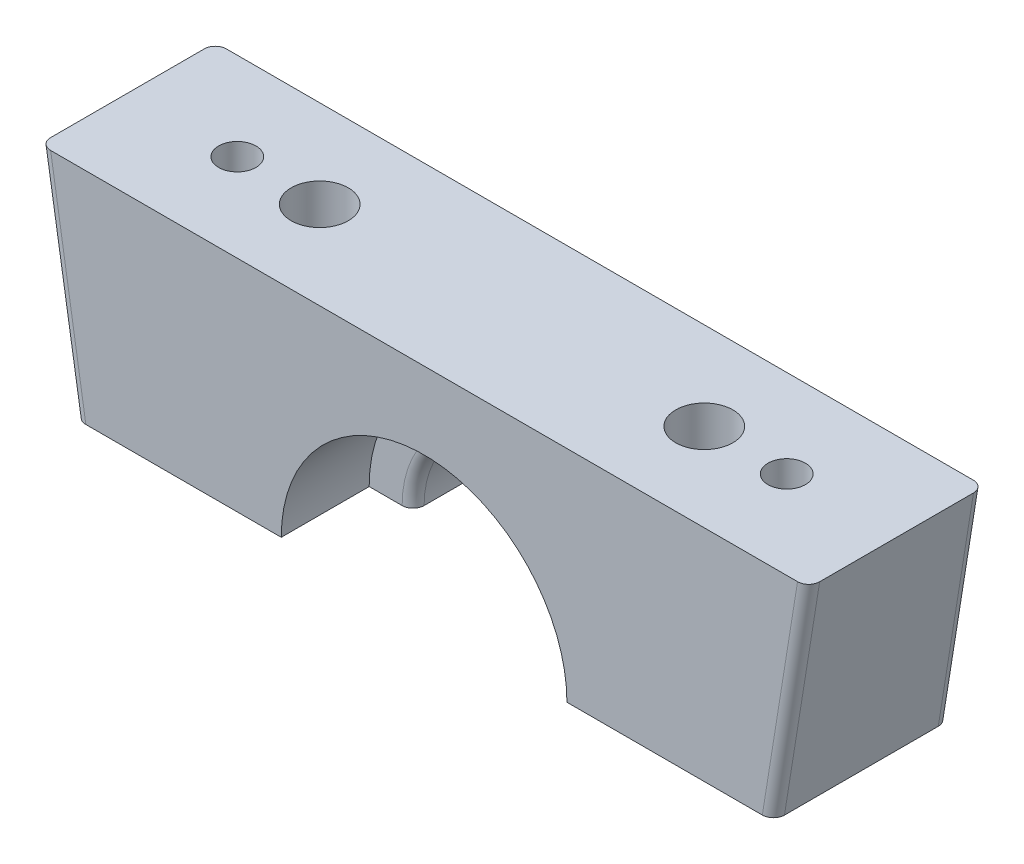
ISO-10303-21;
HEADER;
FILE_DESCRIPTION(('STEP AP214'),'2;1');
FILE_NAME('part.step','',(''),(''),'','','');
FILE_SCHEMA(('AUTOMOTIVE_DESIGN { 1 0 10303 214 1 1 1 1 }'));
ENDSEC;
DATA;
#1=APPLICATION_CONTEXT('core data for automotive mechanical design processes');
#2=APPLICATION_PROTOCOL_DEFINITION('international standard','automotive_design',2000,#1);
#3=PRODUCT_CONTEXT('',#1,'mechanical');
#4=PRODUCT('Part','Part','',(#3));
#5=PRODUCT_RELATED_PRODUCT_CATEGORY('part','',(#4));
#6=PRODUCT_DEFINITION_FORMATION('','',#4);
#7=PRODUCT_DEFINITION_CONTEXT('part definition',#1,'design');
#8=PRODUCT_DEFINITION('design','',#6,#7);
#9=PRODUCT_DEFINITION_SHAPE('','',#8);
#10=(LENGTH_UNIT() NAMED_UNIT(*) SI_UNIT(.MILLI.,.METRE.));
#11=(NAMED_UNIT(*) PLANE_ANGLE_UNIT() SI_UNIT($,.RADIAN.));
#12=(NAMED_UNIT(*) SI_UNIT($,.STERADIAN.) SOLID_ANGLE_UNIT());
#13=UNCERTAINTY_MEASURE_WITH_UNIT(LENGTH_MEASURE(1.E-05),#10,'distance_accuracy_value','');
#14=(GEOMETRIC_REPRESENTATION_CONTEXT(3) GLOBAL_UNCERTAINTY_ASSIGNED_CONTEXT((#13)) GLOBAL_UNIT_ASSIGNED_CONTEXT((#10,
#11,#12)) REPRESENTATION_CONTEXT('',''));
#15=CARTESIAN_POINT('',(0.,0.,0.));
#16=DIRECTION('',(0.,0.,1.));
#17=DIRECTION('',(1.,0.,0.));
#18=AXIS2_PLACEMENT_3D('',#15,#16,#17);
#19=CARTESIAN_POINT('',(-17.5,-20.,0.));
#20=DIRECTION('',(0.,-1.,0.));
#21=DIRECTION('',(0.,0.,-1.));
#22=AXIS2_PLACEMENT_3D('',#19,#20,#21);
#23=CYLINDRICAL_SURFACE('',#22,2.6);
#24=CARTESIAN_POINT('',(-17.5,0.,0.));
#25=DIRECTION('',(0.,-1.,0.));
#26=DIRECTION('',(0.,0.,-1.));
#27=AXIS2_PLACEMENT_3D('',#24,#25,#26);
#28=CIRCLE('',#27,2.6);
#29=CARTESIAN_POINT('',(-17.5,0.,-2.6));
#30=VERTEX_POINT('',#29);
#31=EDGE_CURVE('E366',#30,#30,#28,.T.);
#32=ORIENTED_EDGE('',*,*,#31,.F.);
#33=EDGE_LOOP('',(#32));
#34=FACE_BOUND('',#33,.T.);
#35=CARTESIAN_POINT('',(-17.5,-10.,0.));
#36=DIRECTION('',(0.,-1.,0.));
#37=DIRECTION('',(1.,0.,0.));
#38=AXIS2_PLACEMENT_3D('',#35,#36,#37);
#39=CIRCLE('',#38,2.6);
#40=CARTESIAN_POINT('',(-14.9,-10.,0.));
#41=VERTEX_POINT('',#40);
#42=EDGE_CURVE('E248',#41,#41,#39,.F.);
#43=ORIENTED_EDGE('',*,*,#42,.F.);
#44=EDGE_LOOP('',(#43));
#45=FACE_BOUND('',#44,.T.);
#46=ADVANCED_FACE('F39',(#34,#45),#23,.F.);
#47=CARTESIAN_POINT('',(17.5,-20.,0.));
#48=DIRECTION('',(0.,-1.,0.));
#49=DIRECTION('',(0.,0.,-1.));
#50=AXIS2_PLACEMENT_3D('',#47,#48,#49);
#51=CYLINDRICAL_SURFACE('',#50,2.6);
#52=CARTESIAN_POINT('',(17.5,0.,0.));
#53=DIRECTION('',(0.,-1.,0.));
#54=DIRECTION('',(0.,0.,-1.));
#55=AXIS2_PLACEMENT_3D('',#52,#53,#54);
#56=CIRCLE('',#55,2.6);
#57=CARTESIAN_POINT('',(17.5,0.,-2.6));
#58=VERTEX_POINT('',#57);
#59=EDGE_CURVE('E253',#58,#58,#56,.T.);
#60=ORIENTED_EDGE('',*,*,#59,.F.);
#61=EDGE_LOOP('',(#60));
#62=FACE_BOUND('',#61,.T.);
#63=CARTESIAN_POINT('',(17.5,-10.,0.));
#64=DIRECTION('',(0.,-1.,0.));
#65=DIRECTION('',(1.,0.,0.));
#66=AXIS2_PLACEMENT_3D('',#63,#64,#65);
#67=CIRCLE('',#66,2.6);
#68=CARTESIAN_POINT('',(20.1,-10.,0.));
#69=VERTEX_POINT('',#68);
#70=EDGE_CURVE('E244',#69,#69,#67,.F.);
#71=ORIENTED_EDGE('',*,*,#70,.F.);
#72=EDGE_LOOP('',(#71));
#73=FACE_BOUND('',#72,.T.);
#74=ADVANCED_FACE('F383',(#62,#73),#51,.F.);
#75=CARTESIAN_POINT('',(31.7948717948718,-20.,8.));
#76=DIRECTION('',(0.,1.,0.));
#77=DIRECTION('',(-1.,0.,0.));
#78=AXIS2_PLACEMENT_3D('',#75,#76,#77);
#79=PLANE('',#78);
#80=CARTESIAN_POINT('',(-17.5,-20.,0.));
#81=DIRECTION('',(0.,-1.,0.));
#82=DIRECTION('',(1.,0.,0.));
#83=AXIS2_PLACEMENT_3D('',#80,#81,#82);
#84=CIRCLE('',#83,3.25);
#85=CARTESIAN_POINT('',(-14.25,-20.,0.));
#86=VERTEX_POINT('',#85);
#87=EDGE_CURVE('E355',#86,#86,#84,.T.);
#88=ORIENTED_EDGE('',*,*,#87,.F.);
#89=EDGE_LOOP('',(#88));
#90=FACE_BOUND('',#89,.T.);
#91=DIRECTION('',(0.,0.,-1.));
#92=VECTOR('',#91,1.);
#93=CARTESIAN_POINT('',(-9.,-20.,93.1732257679211));
#94=LINE('',#93,#92);
#95=CARTESIAN_POINT('',(-9.,-20.,-1.));
#96=VERTEX_POINT('',#95);
#97=CARTESIAN_POINT('',(-9.,-20.,-7.00000000000001));
#98=VERTEX_POINT('',#97);
#99=EDGE_CURVE('E209',#96,#98,#94,.T.);
#100=ORIENTED_EDGE('',*,*,#99,.F.);
#101=CARTESIAN_POINT('',(-10.,-20.,-1.));
#102=DIRECTION('',(0.,1.,0.));
#103=DIRECTION('',(-1.,0.,0.));
#104=AXIS2_PLACEMENT_3D('',#101,#102,#103);
#105=CIRCLE('',#104,1.);
#106=CARTESIAN_POINT('',(-10.,-20.,0.));
#107=VERTEX_POINT('',#106);
#108=EDGE_CURVE('E199',#96,#107,#105,.F.);
#109=ORIENTED_EDGE('',*,*,#108,.T.);
#110=DIRECTION('',(1.,0.,0.));
#111=VECTOR('',#110,1.);
#112=CARTESIAN_POINT('',(-13.,-20.,0.));
#113=LINE('',#112,#111);
#114=CARTESIAN_POINT('',(-13.,-20.,0.));
#115=VERTEX_POINT('',#114);
#116=EDGE_CURVE('E184',#115,#107,#113,.T.);
#117=ORIENTED_EDGE('',*,*,#116,.F.);
#118=DIRECTION('',(0.,0.,1.));
#119=VECTOR('',#118,1.);
#120=CARTESIAN_POINT('',(-13.,-20.,0.));
#121=LINE('',#120,#119);
#122=CARTESIAN_POINT('',(-13.,-20.,8.));
#123=VERTEX_POINT('',#122);
#124=EDGE_CURVE('E172',#115,#123,#121,.T.);
#125=ORIENTED_EDGE('',*,*,#124,.T.);
#126=DIRECTION('',(1.,0.,0.));
#127=VECTOR('',#126,1.);
#128=CARTESIAN_POINT('',(31.7948717948718,-20.,8.));
#129=LINE('',#128,#127);
#130=CARTESIAN_POINT('',(-30.7821121407444,-20.,8.));
#131=VERTEX_POINT('',#130);
#132=EDGE_CURVE('E221',#131,#123,#129,.T.);
#133=ORIENTED_EDGE('',*,*,#132,.F.);
#134=CARTESIAN_POINT('',(-30.7821121407444,-20.,7.));
#135=DIRECTION('',(0.,1.,0.));
#136=DIRECTION('',(1.,0.,0.));
#137=AXIS2_PLACEMENT_3D('',#134,#135,#136);
#138=ELLIPSE('',#137,1.01275965412741,1.);
#139=CARTESIAN_POINT('',(-31.7948717948718,-20.,7.));
#140=VERTEX_POINT('',#139);
#141=EDGE_CURVE('E277',#131,#140,#138,.F.);
#142=ORIENTED_EDGE('',*,*,#141,.T.);
#143=DIRECTION('',(0.,0.,-1.));
#144=VECTOR('',#143,1.);
#145=CARTESIAN_POINT('',(-31.7948717948718,-20.,8.));
#146=LINE('',#145,#144);
#147=CARTESIAN_POINT('',(-31.7948717948718,-20.,-7.));
#148=VERTEX_POINT('',#147);
#149=EDGE_CURVE('E211',#140,#148,#146,.T.);
#150=ORIENTED_EDGE('',*,*,#149,.T.);
#151=CARTESIAN_POINT('',(-30.7821121407444,-20.,-7.));
#152=DIRECTION('',(0.,1.,0.));
#153=DIRECTION('',(-1.,0.,0.));
#154=AXIS2_PLACEMENT_3D('',#151,#152,#153);
#155=ELLIPSE('',#154,1.01275965412741,1.);
#156=CARTESIAN_POINT('',(-30.7821121407444,-20.,-8.));
#157=VERTEX_POINT('',#156);
#158=EDGE_CURVE('E274',#148,#157,#155,.F.);
#159=ORIENTED_EDGE('',*,*,#158,.T.);
#160=DIRECTION('',(1.,0.,0.));
#161=VECTOR('',#160,1.);
#162=CARTESIAN_POINT('',(31.7948717948718,-20.,-8.));
#163=LINE('',#162,#161);
#164=CARTESIAN_POINT('',(-10.,-20.,-8.));
#165=VERTEX_POINT('',#164);
#166=EDGE_CURVE('E229',#157,#165,#163,.T.);
#167=ORIENTED_EDGE('',*,*,#166,.T.);
#168=CARTESIAN_POINT('',(-10.,-20.,-7.00000000000001));
#169=DIRECTION('',(0.,1.,0.));
#170=DIRECTION('',(-1.,0.,0.));
#171=AXIS2_PLACEMENT_3D('',#168,#169,#170);
#172=CIRCLE('',#171,1.);
#173=EDGE_CURVE('E280',#165,#98,#172,.F.);
#174=ORIENTED_EDGE('',*,*,#173,.T.);
#175=EDGE_LOOP('',(#100,#109,#117,#125,#133,#142,#150,#159,#167,#174));
#176=FACE_BOUND('',#175,.T.);
#177=CARTESIAN_POINT('',(-25.,-20.,0.));
#178=DIRECTION('',(0.,-1.,0.));
#179=DIRECTION('',(0.,0.,-1.));
#180=AXIS2_PLACEMENT_3D('',#177,#178,#179);
#181=CIRCLE('',#180,3.15);
#182=CARTESIAN_POINT('',(-25.,-20.,-3.15));
#183=VERTEX_POINT('',#182);
#184=EDGE_CURVE('E665',#183,#183,#181,.T.);
#185=ORIENTED_EDGE('',*,*,#184,.F.);
#186=EDGE_LOOP('',(#185));
#187=FACE_BOUND('',#186,.T.);
#188=ADVANCED_FACE('F196',(#90,#176,#187),#79,.F.);
#189=CARTESIAN_POINT('',(17.5,-20.,0.));
#190=DIRECTION('',(0.,-1.,0.));
#191=DIRECTION('',(1.,0.,0.));
#192=AXIS2_PLACEMENT_3D('',#189,#190,#191);
#193=CIRCLE('',#192,3.25);
#194=CARTESIAN_POINT('',(20.75,-20.,0.));
#195=VERTEX_POINT('',#194);
#196=EDGE_CURVE('E356',#195,#195,#193,.T.);
#197=ORIENTED_EDGE('',*,*,#196,.F.);
#198=EDGE_LOOP('',(#197));
#199=FACE_BOUND('',#198,.T.);
#200=CARTESIAN_POINT('',(10.,-20.,0.));
#201=VERTEX_POINT('',#200);
#202=CARTESIAN_POINT('',(13.,-20.,0.));
#203=VERTEX_POINT('',#202);
#204=EDGE_CURVE('E192',#201,#203,#113,.T.);
#205=ORIENTED_EDGE('',*,*,#204,.F.);
#206=CARTESIAN_POINT('',(10.,-20.,-1.));
#207=DIRECTION('',(0.,1.,0.));
#208=DIRECTION('',(-1.,0.,0.));
#209=AXIS2_PLACEMENT_3D('',#206,#207,#208);
#210=CIRCLE('',#209,1.);
#211=CARTESIAN_POINT('',(9.,-20.,-1.));
#212=VERTEX_POINT('',#211);
#213=EDGE_CURVE('E265',#201,#212,#210,.F.);
#214=ORIENTED_EDGE('',*,*,#213,.T.);
#215=DIRECTION('',(0.,0.,-1.));
#216=VECTOR('',#215,1.);
#217=CARTESIAN_POINT('',(9.,-20.,93.1732257679211));
#218=LINE('',#217,#216);
#219=CARTESIAN_POINT('',(9.,-20.,-7.00000000000001));
#220=VERTEX_POINT('',#219);
#221=EDGE_CURVE('E677',#212,#220,#218,.T.);
#222=ORIENTED_EDGE('',*,*,#221,.T.);
#223=CARTESIAN_POINT('',(10.,-20.,-7.00000000000001));
#224=DIRECTION('',(0.,1.,0.));
#225=DIRECTION('',(-1.,0.,0.));
#226=AXIS2_PLACEMENT_3D('',#223,#224,#225);
#227=CIRCLE('',#226,1.);
#228=CARTESIAN_POINT('',(10.,-20.,-8.));
#229=VERTEX_POINT('',#228);
#230=EDGE_CURVE('E262',#220,#229,#227,.F.);
#231=ORIENTED_EDGE('',*,*,#230,.T.);
#232=CARTESIAN_POINT('',(30.7821121407444,-20.,-8.));
#233=VERTEX_POINT('',#232);
#234=EDGE_CURVE('E220',#229,#233,#163,.T.);
#235=ORIENTED_EDGE('',*,*,#234,.T.);
#236=CARTESIAN_POINT('',(30.7821121407444,-20.,-7.));
#237=DIRECTION('',(0.,1.,0.));
#238=DIRECTION('',(-1.,0.,0.));
#239=AXIS2_PLACEMENT_3D('',#236,#237,#238);
#240=ELLIPSE('',#239,1.01275965412741,1.);
#241=CARTESIAN_POINT('',(31.7948717948718,-20.,-7.));
#242=VERTEX_POINT('',#241);
#243=EDGE_CURVE('E256',#233,#242,#240,.F.);
#244=ORIENTED_EDGE('',*,*,#243,.T.);
#245=DIRECTION('',(0.,0.,-1.));
#246=VECTOR('',#245,1.);
#247=CARTESIAN_POINT('',(31.7948717948718,-20.,8.));
#248=LINE('',#247,#246);
#249=CARTESIAN_POINT('',(31.7948717948718,-20.,7.));
#250=VERTEX_POINT('',#249);
#251=EDGE_CURVE('E239',#250,#242,#248,.T.);
#252=ORIENTED_EDGE('',*,*,#251,.F.);
#253=CARTESIAN_POINT('',(30.7821121407444,-20.,7.));
#254=DIRECTION('',(0.,1.,0.));
#255=DIRECTION('',(1.,0.,0.));
#256=AXIS2_PLACEMENT_3D('',#253,#254,#255);
#257=ELLIPSE('',#256,1.01275965412741,1.);
#258=CARTESIAN_POINT('',(30.7821121407444,-20.,8.));
#259=VERTEX_POINT('',#258);
#260=EDGE_CURVE('E259',#250,#259,#257,.F.);
#261=ORIENTED_EDGE('',*,*,#260,.T.);
#262=CARTESIAN_POINT('',(13.,-20.,8.));
#263=VERTEX_POINT('',#262);
#264=EDGE_CURVE('E224',#263,#259,#129,.T.);
#265=ORIENTED_EDGE('',*,*,#264,.F.);
#266=DIRECTION('',(0.,0.,1.));
#267=VECTOR('',#266,1.);
#268=CARTESIAN_POINT('',(13.,-20.,0.));
#269=LINE('',#268,#267);
#270=EDGE_CURVE('E183',#203,#263,#269,.T.);
#271=ORIENTED_EDGE('',*,*,#270,.F.);
#272=EDGE_LOOP('',(#205,#214,#222,#231,#235,#244,#252,#261,#265,#271));
#273=FACE_BOUND('',#272,.T.);
#274=CARTESIAN_POINT('',(25.,-20.,0.));
#275=DIRECTION('',(0.,-1.,0.));
#276=DIRECTION('',(0.,0.,-1.));
#277=AXIS2_PLACEMENT_3D('',#274,#275,#276);
#278=CIRCLE('',#277,3.15);
#279=CARTESIAN_POINT('',(25.,-20.,-3.15));
#280=VERTEX_POINT('',#279);
#281=EDGE_CURVE('E362',#280,#280,#278,.T.);
#282=ORIENTED_EDGE('',*,*,#281,.F.);
#283=EDGE_LOOP('',(#282));
#284=FACE_BOUND('',#283,.T.);
#285=ADVANCED_FACE('F346',(#199,#273,#284),#79,.F.);
#286=CARTESIAN_POINT('',(35.,0.,8.));
#287=DIRECTION('',(-0.987401103435145,0.158237356319735,0.));
#288=DIRECTION('',(-0.158237356319735,-0.987401103435145,0.));
#289=AXIS2_PLACEMENT_3D('',#286,#287,#288);
#290=PLANE('',#289);
#291=DIRECTION('',(0.,0.,-1.));
#292=VECTOR('',#291,1.);
#293=CARTESIAN_POINT('',(35.,0.,8.));
#294=LINE('',#293,#292);
#295=CARTESIAN_POINT('',(35.,0.,7.));
#296=VERTEX_POINT('',#295);
#297=CARTESIAN_POINT('',(35.,0.,-7.));
#298=VERTEX_POINT('',#297);
#299=EDGE_CURVE('E228',#296,#298,#294,.T.);
#300=ORIENTED_EDGE('',*,*,#299,.F.);
#301=DIRECTION('',(0.158237356319735,0.987401103435145,0.));
#302=VECTOR('',#301,1.);
#303=CARTESIAN_POINT('',(35.,0.,7.));
#304=LINE('',#303,#302);
#305=EDGE_CURVE('E315',#296,#250,#304,.F.);
#306=ORIENTED_EDGE('',*,*,#305,.T.);
#307=ORIENTED_EDGE('',*,*,#251,.T.);
#308=DIRECTION('',(0.158237356319735,0.987401103435145,0.));
#309=VECTOR('',#308,1.);
#310=CARTESIAN_POINT('',(35.,0.,-7.));
#311=LINE('',#310,#309);
#312=EDGE_CURVE('E312',#242,#298,#311,.T.);
#313=ORIENTED_EDGE('',*,*,#312,.T.);
#314=EDGE_LOOP('',(#300,#306,#307,#313));
#315=FACE_BOUND('',#314,.T.);
#316=ADVANCED_FACE('F337',(#315),#290,.F.);
#317=CARTESIAN_POINT('',(0.,0.,8.));
#318=DIRECTION('',(0.,-1.,0.));
#319=DIRECTION('',(0.,0.,-1.));
#320=AXIS2_PLACEMENT_3D('',#317,#318,#319);
#321=PLANE('',#320);
#322=ORIENTED_EDGE('',*,*,#59,.T.);
#323=EDGE_LOOP('',(#322));
#324=FACE_BOUND('',#323,.T.);
#325=ORIENTED_EDGE('',*,*,#31,.T.);
#326=EDGE_LOOP('',(#325));
#327=FACE_BOUND('',#326,.T.);
#328=CARTESIAN_POINT('',(25.,0.,0.));
#329=DIRECTION('',(0.,-1.,0.));
#330=DIRECTION('',(0.,0.,-1.));
#331=AXIS2_PLACEMENT_3D('',#328,#329,#330);
#332=CIRCLE('',#331,1.7);
#333=CARTESIAN_POINT('',(25.,0.,-1.7));
#334=VERTEX_POINT('',#333);
#335=EDGE_CURVE('E369',#334,#334,#332,.T.);
#336=ORIENTED_EDGE('',*,*,#335,.T.);
#337=EDGE_LOOP('',(#336));
#338=FACE_BOUND('',#337,.T.);
#339=CARTESIAN_POINT('',(-25.,0.,0.));
#340=DIRECTION('',(0.,-1.,0.));
#341=DIRECTION('',(0.,0.,-1.));
#342=AXIS2_PLACEMENT_3D('',#339,#340,#341);
#343=CIRCLE('',#342,1.7);
#344=CARTESIAN_POINT('',(-25.,0.,-1.7));
#345=VERTEX_POINT('',#344);
#346=EDGE_CURVE('E673',#345,#345,#343,.T.);
#347=ORIENTED_EDGE('',*,*,#346,.T.);
#348=EDGE_LOOP('',(#347));
#349=FACE_BOUND('',#348,.T.);
#350=DIRECTION('',(-1.,0.,0.));
#351=VECTOR('',#350,1.);
#352=CARTESIAN_POINT('',(0.,0.,8.));
#353=LINE('',#352,#351);
#354=CARTESIAN_POINT('',(33.9872403458726,0.,8.));
#355=VERTEX_POINT('',#354);
#356=CARTESIAN_POINT('',(-33.9872403458726,0.,8.));
#357=VERTEX_POINT('',#356);
#358=EDGE_CURVE('E223',#355,#357,#353,.T.);
#359=ORIENTED_EDGE('',*,*,#358,.F.);
#360=CARTESIAN_POINT('',(33.9872403458726,0.,7.));
#361=DIRECTION('',(0.,-1.,0.));
#362=DIRECTION('',(1.,0.,0.));
#363=AXIS2_PLACEMENT_3D('',#360,#361,#362);
#364=ELLIPSE('',#363,1.01275965412741,1.);
#365=EDGE_CURVE('E68',#355,#296,#364,.F.);
#366=ORIENTED_EDGE('',*,*,#365,.T.);
#367=ORIENTED_EDGE('',*,*,#299,.T.);
#368=CARTESIAN_POINT('',(33.9872403458726,0.,-7.));
#369=DIRECTION('',(0.,-1.,0.));
#370=DIRECTION('',(-1.,0.,0.));
#371=AXIS2_PLACEMENT_3D('',#368,#369,#370);
#372=ELLIPSE('',#371,1.01275965412741,1.);
#373=CARTESIAN_POINT('',(33.9872403458726,0.,-8.));
#374=VERTEX_POINT('',#373);
#375=EDGE_CURVE('E58',#298,#374,#372,.F.);
#376=ORIENTED_EDGE('',*,*,#375,.T.);
#377=DIRECTION('',(-1.,0.,0.));
#378=VECTOR('',#377,1.);
#379=CARTESIAN_POINT('',(0.,0.,-8.));
#380=LINE('',#379,#378);
#381=CARTESIAN_POINT('',(-33.9872403458726,0.,-8.));
#382=VERTEX_POINT('',#381);
#383=EDGE_CURVE('E233',#374,#382,#380,.T.);
#384=ORIENTED_EDGE('',*,*,#383,.T.);
#385=CARTESIAN_POINT('',(-33.9872403458726,0.,-7.));
#386=DIRECTION('',(0.,-1.,0.));
#387=DIRECTION('',(-1.,0.,0.));
#388=AXIS2_PLACEMENT_3D('',#385,#386,#387);
#389=ELLIPSE('',#388,1.01275965412741,1.);
#390=CARTESIAN_POINT('',(-35.,0.,-7.));
#391=VERTEX_POINT('',#390);
#392=EDGE_CURVE('E304',#382,#391,#389,.F.);
#393=ORIENTED_EDGE('',*,*,#392,.T.);
#394=DIRECTION('',(0.,0.,-1.));
#395=VECTOR('',#394,1.);
#396=CARTESIAN_POINT('',(-35.,0.,8.));
#397=LINE('',#396,#395);
#398=CARTESIAN_POINT('',(-35.,0.,7.));
#399=VERTEX_POINT('',#398);
#400=EDGE_CURVE('E216',#399,#391,#397,.T.);
#401=ORIENTED_EDGE('',*,*,#400,.F.);
#402=CARTESIAN_POINT('',(-33.9872403458726,0.,7.));
#403=DIRECTION('',(0.,-1.,0.));
#404=DIRECTION('',(1.,0.,0.));
#405=AXIS2_PLACEMENT_3D('',#402,#403,#404);
#406=ELLIPSE('',#405,1.01275965412741,1.);
#407=EDGE_CURVE('E307',#399,#357,#406,.F.);
#408=ORIENTED_EDGE('',*,*,#407,.T.);
#409=EDGE_LOOP('',(#359,#366,#367,#376,#384,#393,#401,#408));
#410=FACE_BOUND('',#409,.T.);
#411=ADVANCED_FACE('F334',(#324,#327,#338,#349,#410),#321,.F.);
#412=CARTESIAN_POINT('',(0.,0.,8.));
#413=DIRECTION('',(0.,0.,-1.));
#414=DIRECTION('',(-1.,0.,0.));
#415=AXIS2_PLACEMENT_3D('',#412,#413,#414);
#416=PLANE('',#415);
#417=ORIENTED_EDGE('',*,*,#264,.T.);
#418=DIRECTION('',(0.158237356319735,0.987401103435145,0.));
#419=VECTOR('',#418,1.);
#420=CARTESIAN_POINT('',(33.1362317638378,-5.31029355189708,8.));
#421=LINE('',#420,#419);
#422=EDGE_CURVE('E298',#259,#355,#421,.T.);
#423=ORIENTED_EDGE('',*,*,#422,.T.);
#424=ORIENTED_EDGE('',*,*,#358,.T.);
#425=DIRECTION('',(-0.158237356319735,0.987401103435145,0.));
#426=VECTOR('',#425,1.);
#427=CARTESIAN_POINT('',(-30.8074706914367,-19.8417626436803,8.));
#428=LINE('',#427,#426);
#429=EDGE_CURVE('E295',#357,#131,#428,.F.);
#430=ORIENTED_EDGE('',*,*,#429,.T.);
#431=ORIENTED_EDGE('',*,*,#132,.T.);
#432=CARTESIAN_POINT('',(0.,-20.,8.));
#433=DIRECTION('',(0.,0.,1.));
#434=DIRECTION('',(1.,0.,0.));
#435=AXIS2_PLACEMENT_3D('',#432,#433,#434);
#436=CIRCLE('',#435,13.);
#437=EDGE_CURVE('E178',#263,#123,#436,.T.);
#438=ORIENTED_EDGE('',*,*,#437,.F.);
#439=EDGE_LOOP('',(#417,#423,#424,#430,#431,#438));
#440=FACE_BOUND('',#439,.T.);
#441=ADVANCED_FACE('F349',(#440),#416,.F.);
#442=CARTESIAN_POINT('',(0.,0.,-8.));
#443=DIRECTION('',(0.,0.,-1.));
#444=DIRECTION('',(-1.,0.,0.));
#445=AXIS2_PLACEMENT_3D('',#442,#443,#444);
#446=PLANE('',#445);
#447=ORIENTED_EDGE('',*,*,#234,.F.);
#448=CARTESIAN_POINT('',(0.,-20.,-8.));
#449=DIRECTION('',(0.,0.,-1.));
#450=DIRECTION('',(-1.,0.,0.));
#451=AXIS2_PLACEMENT_3D('',#448,#449,#450);
#452=CIRCLE('',#451,10.);
#453=EDGE_CURVE('E291',#229,#165,#452,.F.);
#454=ORIENTED_EDGE('',*,*,#453,.T.);
#455=ORIENTED_EDGE('',*,*,#166,.F.);
#456=DIRECTION('',(-0.158237356319735,0.987401103435145,0.));
#457=VECTOR('',#456,1.);
#458=CARTESIAN_POINT('',(-33.1362317638378,-5.31029355189708,-8.));
#459=LINE('',#458,#457);
#460=EDGE_CURVE('E287',#157,#382,#459,.T.);
#461=ORIENTED_EDGE('',*,*,#460,.T.);
#462=ORIENTED_EDGE('',*,*,#383,.F.);
#463=DIRECTION('',(0.158237356319735,0.987401103435145,0.));
#464=VECTOR('',#463,1.);
#465=CARTESIAN_POINT('',(30.8074706914367,-19.8417626436803,-8.));
#466=LINE('',#465,#464);
#467=EDGE_CURVE('E284',#374,#233,#466,.F.);
#468=ORIENTED_EDGE('',*,*,#467,.T.);
#469=EDGE_LOOP('',(#447,#454,#455,#461,#462,#468));
#470=FACE_BOUND('',#469,.T.);
#471=ADVANCED_FACE('F333',(#470),#446,.T.);
#472=CARTESIAN_POINT('',(-35.,0.,8.));
#473=DIRECTION('',(-0.987401103435145,-0.158237356319735,0.));
#474=DIRECTION('',(0.158237356319735,-0.987401103435145,0.));
#475=AXIS2_PLACEMENT_3D('',#472,#473,#474);
#476=PLANE('',#475);
#477=ORIENTED_EDGE('',*,*,#149,.F.);
#478=DIRECTION('',(-0.158237356319735,0.987401103435145,0.));
#479=VECTOR('',#478,1.);
#480=CARTESIAN_POINT('',(-35.,0.,7.));
#481=LINE('',#480,#479);
#482=EDGE_CURVE('E11',#140,#399,#481,.T.);
#483=ORIENTED_EDGE('',*,*,#482,.T.);
#484=ORIENTED_EDGE('',*,*,#400,.T.);
#485=DIRECTION('',(-0.158237356319735,0.987401103435145,0.));
#486=VECTOR('',#485,1.);
#487=CARTESIAN_POINT('',(-35.,0.,-7.));
#488=LINE('',#487,#486);
#489=EDGE_CURVE('E48',#391,#148,#488,.F.);
#490=ORIENTED_EDGE('',*,*,#489,.T.);
#491=EDGE_LOOP('',(#477,#483,#484,#490));
#492=FACE_BOUND('',#491,.T.);
#493=ADVANCED_FACE('F321',(#492),#476,.T.);
#494=CARTESIAN_POINT('',(0.,-20.,0.));
#495=DIRECTION('',(0.,0.,1.));
#496=DIRECTION('',(1.,0.,0.));
#497=AXIS2_PLACEMENT_3D('',#494,#495,#496);
#498=CYLINDRICAL_SURFACE('',#497,13.);
#499=ORIENTED_EDGE('',*,*,#437,.T.);
#500=ORIENTED_EDGE('',*,*,#124,.F.);
#501=CARTESIAN_POINT('',(0.,-20.,0.));
#502=DIRECTION('',(0.,0.,1.));
#503=DIRECTION('',(1.,0.,0.));
#504=AXIS2_PLACEMENT_3D('',#501,#502,#503);
#505=CIRCLE('',#504,13.);
#506=EDGE_CURVE('E175',#203,#115,#505,.T.);
#507=ORIENTED_EDGE('',*,*,#506,.F.);
#508=ORIENTED_EDGE('',*,*,#270,.T.);
#509=EDGE_LOOP('',(#499,#500,#507,#508));
#510=FACE_BOUND('',#509,.T.);
#511=ADVANCED_FACE('F174',(#510),#498,.F.);
#512=CARTESIAN_POINT('',(0.,-20.,0.));
#513=DIRECTION('',(0.,0.,1.));
#514=DIRECTION('',(1.,0.,0.));
#515=AXIS2_PLACEMENT_3D('',#512,#513,#514);
#516=PLANE('',#515);
#517=ORIENTED_EDGE('',*,*,#116,.T.);
#518=CARTESIAN_POINT('',(0.,-20.,0.));
#519=DIRECTION('',(0.,0.,1.));
#520=DIRECTION('',(1.,0.,0.));
#521=AXIS2_PLACEMENT_3D('',#518,#519,#520);
#522=CIRCLE('',#521,10.);
#523=EDGE_CURVE('E243',#107,#201,#522,.F.);
#524=ORIENTED_EDGE('',*,*,#523,.T.);
#525=ORIENTED_EDGE('',*,*,#204,.T.);
#526=ORIENTED_EDGE('',*,*,#506,.T.);
#527=EDGE_LOOP('',(#517,#524,#525,#526));
#528=FACE_BOUND('',#527,.T.);
#529=ADVANCED_FACE('F188',(#528),#516,.T.);
#530=CARTESIAN_POINT('',(0.,-20.,93.1732257679211));
#531=DIRECTION('',(0.,0.,-1.));
#532=DIRECTION('',(-1.,0.,0.));
#533=AXIS2_PLACEMENT_3D('',#530,#531,#532);
#534=CYLINDRICAL_SURFACE('',#533,9.);
#535=ORIENTED_EDGE('',*,*,#221,.F.);
#536=CARTESIAN_POINT('',(0.,-20.,-1.));
#537=DIRECTION('',(0.,0.,1.));
#538=DIRECTION('',(1.,0.,0.));
#539=AXIS2_PLACEMENT_3D('',#536,#537,#538);
#540=CIRCLE('',#539,9.);
#541=EDGE_CURVE('E271',#212,#96,#540,.T.);
#542=ORIENTED_EDGE('',*,*,#541,.T.);
#543=ORIENTED_EDGE('',*,*,#99,.T.);
#544=CARTESIAN_POINT('',(0.,-20.,-7.00000000000001));
#545=DIRECTION('',(0.,0.,-1.));
#546=DIRECTION('',(-1.,0.,0.));
#547=AXIS2_PLACEMENT_3D('',#544,#545,#546);
#548=CIRCLE('',#547,9.);
#549=EDGE_CURVE('E268',#98,#220,#548,.T.);
#550=ORIENTED_EDGE('',*,*,#549,.T.);
#551=EDGE_LOOP('',(#535,#542,#543,#550));
#552=FACE_BOUND('',#551,.T.);
#553=ADVANCED_FACE('F411',(#552),#534,.F.);
#554=CARTESIAN_POINT('',(-25.,-20.,0.));
#555=DIRECTION('',(0.,-1.,0.));
#556=DIRECTION('',(0.,0.,-1.));
#557=AXIS2_PLACEMENT_3D('',#554,#555,#556);
#558=CYLINDRICAL_SURFACE('',#557,1.7);
#559=ORIENTED_EDGE('',*,*,#346,.F.);
#560=EDGE_LOOP('',(#559));
#561=FACE_BOUND('',#560,.T.);
#562=CARTESIAN_POINT('',(-25.,-18.55,0.));
#563=DIRECTION('',(0.,-1.,0.));
#564=DIRECTION('',(0.,0.,-1.));
#565=AXIS2_PLACEMENT_3D('',#562,#563,#564);
#566=CIRCLE('',#565,1.7);
#567=CARTESIAN_POINT('',(-25.,-18.55,-1.7));
#568=VERTEX_POINT('',#567);
#569=EDGE_CURVE('E669',#568,#568,#566,.T.);
#570=ORIENTED_EDGE('',*,*,#569,.T.);
#571=EDGE_LOOP('',(#570));
#572=FACE_BOUND('',#571,.T.);
#573=ADVANCED_FACE('F407',(#561,#572),#558,.F.);
#574=CARTESIAN_POINT('',(-25.,-20.,0.));
#575=DIRECTION('',(0.,-1.,0.));
#576=DIRECTION('',(0.,0.,-1.));
#577=AXIS2_PLACEMENT_3D('',#574,#575,#576);
#578=CONICAL_SURFACE('',#577,3.15,0.785398163397448);
#579=ORIENTED_EDGE('',*,*,#569,.F.);
#580=EDGE_LOOP('',(#579));
#581=FACE_BOUND('',#580,.T.);
#582=ORIENTED_EDGE('',*,*,#184,.T.);
#583=EDGE_LOOP('',(#582));
#584=FACE_BOUND('',#583,.T.);
#585=ADVANCED_FACE('F403',(#581,#584),#578,.F.);
#586=CARTESIAN_POINT('',(25.,-20.,0.));
#587=DIRECTION('',(0.,-1.,0.));
#588=DIRECTION('',(0.,0.,-1.));
#589=AXIS2_PLACEMENT_3D('',#586,#587,#588);
#590=CYLINDRICAL_SURFACE('',#589,1.7);
#591=ORIENTED_EDGE('',*,*,#335,.F.);
#592=EDGE_LOOP('',(#591));
#593=FACE_BOUND('',#592,.T.);
#594=CARTESIAN_POINT('',(25.,-18.55,0.));
#595=DIRECTION('',(0.,-1.,0.));
#596=DIRECTION('',(0.,0.,-1.));
#597=AXIS2_PLACEMENT_3D('',#594,#595,#596);
#598=CIRCLE('',#597,1.7);
#599=CARTESIAN_POINT('',(25.,-18.55,-1.7));
#600=VERTEX_POINT('',#599);
#601=EDGE_CURVE('E365',#600,#600,#598,.T.);
#602=ORIENTED_EDGE('',*,*,#601,.T.);
#603=EDGE_LOOP('',(#602));
#604=FACE_BOUND('',#603,.T.);
#605=ADVANCED_FACE('F399',(#593,#604),#590,.F.);
#606=CARTESIAN_POINT('',(25.,-20.,0.));
#607=DIRECTION('',(0.,-1.,0.));
#608=DIRECTION('',(0.,0.,-1.));
#609=AXIS2_PLACEMENT_3D('',#606,#607,#608);
#610=CONICAL_SURFACE('',#609,3.15,0.785398163397448);
#611=ORIENTED_EDGE('',*,*,#601,.F.);
#612=EDGE_LOOP('',(#611));
#613=FACE_BOUND('',#612,.T.);
#614=ORIENTED_EDGE('',*,*,#281,.T.);
#615=EDGE_LOOP('',(#614));
#616=FACE_BOUND('',#615,.T.);
#617=ADVANCED_FACE('F395',(#613,#616),#610,.F.);
#618=CARTESIAN_POINT('',(17.5,-10.,0.));
#619=DIRECTION('',(0.,-1.,0.));
#620=DIRECTION('',(1.,0.,0.));
#621=AXIS2_PLACEMENT_3D('',#618,#619,#620);
#622=PLANE('',#621);
#623=CARTESIAN_POINT('',(17.5,-10.,0.));
#624=DIRECTION('',(0.,-1.,0.));
#625=DIRECTION('',(1.,0.,0.));
#626=AXIS2_PLACEMENT_3D('',#623,#624,#625);
#627=CIRCLE('',#626,3.25);
#628=CARTESIAN_POINT('',(20.75,-10.,0.));
#629=VERTEX_POINT('',#628);
#630=EDGE_CURVE('E353',#629,#629,#627,.T.);
#631=ORIENTED_EDGE('',*,*,#630,.T.);
#632=EDGE_LOOP('',(#631));
#633=FACE_BOUND('',#632,.T.);
#634=ORIENTED_EDGE('',*,*,#70,.T.);
#635=EDGE_LOOP('',(#634));
#636=FACE_BOUND('',#635,.T.);
#637=ADVANCED_FACE('F398',(#633,#636),#622,.T.);
#638=CARTESIAN_POINT('',(17.5,-10.,0.));
#639=DIRECTION('',(0.,-1.,0.));
#640=DIRECTION('',(1.,0.,0.));
#641=AXIS2_PLACEMENT_3D('',#638,#639,#640);
#642=CYLINDRICAL_SURFACE('',#641,3.25);
#643=ORIENTED_EDGE('',*,*,#630,.F.);
#644=EDGE_LOOP('',(#643));
#645=FACE_BOUND('',#644,.T.);
#646=ORIENTED_EDGE('',*,*,#196,.T.);
#647=EDGE_LOOP('',(#646));
#648=FACE_BOUND('',#647,.T.);
#649=ADVANCED_FACE('F500',(#645,#648),#642,.F.);
#650=CARTESIAN_POINT('',(-17.5,-10.,0.));
#651=DIRECTION('',(0.,-1.,0.));
#652=DIRECTION('',(1.,0.,0.));
#653=AXIS2_PLACEMENT_3D('',#650,#651,#652);
#654=PLANE('',#653);
#655=CARTESIAN_POINT('',(-17.5,-10.,0.));
#656=DIRECTION('',(0.,-1.,0.));
#657=DIRECTION('',(1.,0.,0.));
#658=AXIS2_PLACEMENT_3D('',#655,#656,#657);
#659=CIRCLE('',#658,3.25);
#660=CARTESIAN_POINT('',(-14.25,-10.,0.));
#661=VERTEX_POINT('',#660);
#662=EDGE_CURVE('E249',#661,#661,#659,.T.);
#663=ORIENTED_EDGE('',*,*,#662,.T.);
#664=EDGE_LOOP('',(#663));
#665=FACE_BOUND('',#664,.T.);
#666=ORIENTED_EDGE('',*,*,#42,.T.);
#667=EDGE_LOOP('',(#666));
#668=FACE_BOUND('',#667,.T.);
#669=ADVANCED_FACE('F489',(#665,#668),#654,.T.);
#670=CARTESIAN_POINT('',(-17.5,-10.,0.));
#671=DIRECTION('',(0.,-1.,0.));
#672=DIRECTION('',(1.,0.,0.));
#673=AXIS2_PLACEMENT_3D('',#670,#671,#672);
#674=CYLINDRICAL_SURFACE('',#673,3.25);
#675=ORIENTED_EDGE('',*,*,#662,.F.);
#676=EDGE_LOOP('',(#675));
#677=FACE_BOUND('',#676,.T.);
#678=ORIENTED_EDGE('',*,*,#87,.T.);
#679=EDGE_LOOP('',(#678));
#680=FACE_BOUND('',#679,.T.);
#681=ADVANCED_FACE('F438',(#677,#680),#674,.F.);
#682=CARTESIAN_POINT('',(0.,-20.,-1.));
#683=DIRECTION('',(0.,0.,1.));
#684=DIRECTION('',(1.,0.,0.));
#685=AXIS2_PLACEMENT_3D('',#682,#683,#684);
#686=TOROIDAL_SURFACE('',#685,10.,1.);
#687=ORIENTED_EDGE('',*,*,#108,.F.);
#688=ORIENTED_EDGE('',*,*,#541,.F.);
#689=ORIENTED_EDGE('',*,*,#213,.F.);
#690=ORIENTED_EDGE('',*,*,#523,.F.);
#691=EDGE_LOOP('',(#687,#688,#689,#690));
#692=FACE_BOUND('',#691,.T.);
#693=ADVANCED_FACE('F434',(#692),#686,.T.);
#694=CARTESIAN_POINT('',(0.,-20.,-7.00000000000001));
#695=DIRECTION('',(0.,0.,-1.));
#696=DIRECTION('',(-1.,0.,0.));
#697=AXIS2_PLACEMENT_3D('',#694,#695,#696);
#698=TOROIDAL_SURFACE('',#697,10.,1.);
#699=ORIENTED_EDGE('',*,*,#230,.F.);
#700=ORIENTED_EDGE('',*,*,#549,.F.);
#701=ORIENTED_EDGE('',*,*,#173,.F.);
#702=ORIENTED_EDGE('',*,*,#453,.F.);
#703=EDGE_LOOP('',(#699,#700,#701,#702));
#704=FACE_BOUND('',#703,.T.);
#705=ADVANCED_FACE('F437',(#704),#698,.T.);
#706=CARTESIAN_POINT('',(33.1362317638378,-5.31029355189708,7.));
#707=DIRECTION('',(0.158237356319735,0.987401103435145,0.));
#708=DIRECTION('',(-0.987401103435145,0.158237356319735,0.));
#709=AXIS2_PLACEMENT_3D('',#706,#707,#708);
#710=CYLINDRICAL_SURFACE('',#709,1.);
#711=ORIENTED_EDGE('',*,*,#260,.F.);
#712=ORIENTED_EDGE('',*,*,#305,.F.);
#713=ORIENTED_EDGE('',*,*,#365,.F.);
#714=ORIENTED_EDGE('',*,*,#422,.F.);
#715=EDGE_LOOP('',(#711,#712,#713,#714));
#716=FACE_BOUND('',#715,.T.);
#717=ADVANCED_FACE('F341',(#716),#710,.T.);
#718=CARTESIAN_POINT('',(-34.0125988965649,0.158237356319735,7.));
#719=DIRECTION('',(0.158237356319735,-0.987401103435145,0.));
#720=DIRECTION('',(0.987401103435145,0.158237356319735,0.));
#721=AXIS2_PLACEMENT_3D('',#718,#719,#720);
#722=CYLINDRICAL_SURFACE('',#721,1.);
#723=ORIENTED_EDGE('',*,*,#141,.F.);
#724=ORIENTED_EDGE('',*,*,#429,.F.);
#725=ORIENTED_EDGE('',*,*,#407,.F.);
#726=ORIENTED_EDGE('',*,*,#482,.F.);
#727=EDGE_LOOP('',(#723,#724,#725,#726));
#728=FACE_BOUND('',#727,.T.);
#729=ADVANCED_FACE('F381',(#728),#722,.T.);
#730=CARTESIAN_POINT('',(-33.1362317638378,-5.31029355189708,-7.));
#731=DIRECTION('',(-0.158237356319735,0.987401103435145,0.));
#732=DIRECTION('',(-0.987401103435145,-0.158237356319735,0.));
#733=AXIS2_PLACEMENT_3D('',#730,#731,#732);
#734=CYLINDRICAL_SURFACE('',#733,1.);
#735=ORIENTED_EDGE('',*,*,#158,.F.);
#736=ORIENTED_EDGE('',*,*,#489,.F.);
#737=ORIENTED_EDGE('',*,*,#392,.F.);
#738=ORIENTED_EDGE('',*,*,#460,.F.);
#739=EDGE_LOOP('',(#735,#736,#737,#738));
#740=FACE_BOUND('',#739,.T.);
#741=ADVANCED_FACE('F329',(#740),#734,.T.);
#742=CARTESIAN_POINT('',(34.0125988965649,0.158237356319735,-7.));
#743=DIRECTION('',(-0.158237356319735,-0.987401103435145,0.));
#744=DIRECTION('',(0.987401103435145,-0.158237356319735,0.));
#745=AXIS2_PLACEMENT_3D('',#742,#743,#744);
#746=CYLINDRICAL_SURFACE('',#745,1.);
#747=ORIENTED_EDGE('',*,*,#243,.F.);
#748=ORIENTED_EDGE('',*,*,#467,.F.);
#749=ORIENTED_EDGE('',*,*,#375,.F.);
#750=ORIENTED_EDGE('',*,*,#312,.F.);
#751=EDGE_LOOP('',(#747,#748,#749,#750));
#752=FACE_BOUND('',#751,.T.);
#753=ADVANCED_FACE('F41',(#752),#746,.T.);
#754=CLOSED_SHELL('',(#46,#74,#188,#285,#316,#411,#441,#471,#493,#511,#529,#553,#573,#585,#605,
#617,#637,#649,#669,#681,#693,#705,#717,#729,#741,#753));
#755=MANIFOLD_SOLID_BREP('B2',#754);
#756=ADVANCED_BREP_SHAPE_REPRESENTATION('',(#18,#755),#14);
#757=SHAPE_DEFINITION_REPRESENTATION(#9,#756);
ENDSEC;
END-ISO-10303-21;
